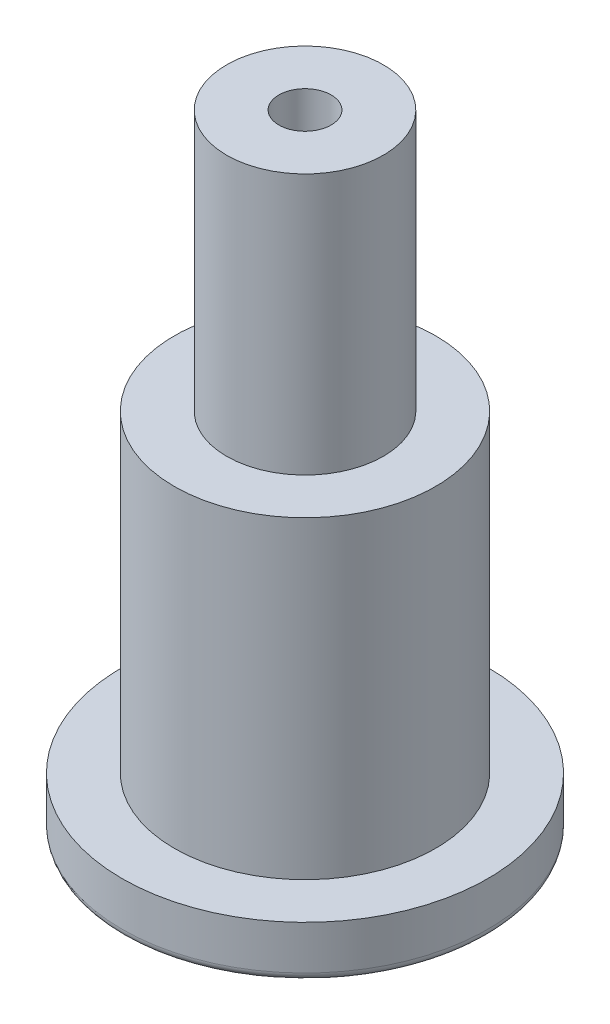
ISO-10303-21;
HEADER;
FILE_DESCRIPTION(('STEP AP214'),'2;1');
FILE_NAME('part.step','',(''),(''),'','','');
FILE_SCHEMA(('AUTOMOTIVE_DESIGN { 1 0 10303 214 1 1 1 1 }'));
ENDSEC;
DATA;
#1=APPLICATION_CONTEXT('core data for automotive mechanical design processes');
#2=APPLICATION_PROTOCOL_DEFINITION('international standard','automotive_design',2000,#1);
#3=PRODUCT_CONTEXT('',#1,'mechanical');
#4=PRODUCT('Part','Part','',(#3));
#5=PRODUCT_RELATED_PRODUCT_CATEGORY('part','',(#4));
#6=PRODUCT_DEFINITION_FORMATION('','',#4);
#7=PRODUCT_DEFINITION_CONTEXT('part definition',#1,'design');
#8=PRODUCT_DEFINITION('design','',#6,#7);
#9=PRODUCT_DEFINITION_SHAPE('','',#8);
#10=(LENGTH_UNIT() NAMED_UNIT(*) SI_UNIT(.MILLI.,.METRE.));
#11=(NAMED_UNIT(*) PLANE_ANGLE_UNIT() SI_UNIT($,.RADIAN.));
#12=(NAMED_UNIT(*) SI_UNIT($,.STERADIAN.) SOLID_ANGLE_UNIT());
#13=UNCERTAINTY_MEASURE_WITH_UNIT(LENGTH_MEASURE(1.E-05),#10,'distance_accuracy_value','');
#14=(GEOMETRIC_REPRESENTATION_CONTEXT(3) GLOBAL_UNCERTAINTY_ASSIGNED_CONTEXT((#13)) GLOBAL_UNIT_ASSIGNED_CONTEXT((#10,
#11,#12)) REPRESENTATION_CONTEXT('',''));
#15=CARTESIAN_POINT('',(0.,0.,0.));
#16=DIRECTION('',(0.,0.,1.));
#17=DIRECTION('',(1.,0.,0.));
#18=AXIS2_PLACEMENT_3D('',#15,#16,#17);
#19=CARTESIAN_POINT('',(0.,1.5875,0.));
#20=DIRECTION('',(0.,-1.,0.));
#21=DIRECTION('',(0.,0.,-1.));
#22=AXIS2_PLACEMENT_3D('',#19,#20,#21);
#23=CYLINDRICAL_SURFACE('',#22,5.55625);
#24=CARTESIAN_POINT('',(0.,0.254,0.));
#25=DIRECTION('',(0.,1.,0.));
#26=DIRECTION('',(0.,0.,1.));
#27=AXIS2_PLACEMENT_3D('',#24,#25,#26);
#28=CIRCLE('',#27,5.55625);
#29=CARTESIAN_POINT('',(0.,0.254,5.55625));
#30=VERTEX_POINT('',#29);
#31=EDGE_CURVE('E52',#30,#30,#28,.T.);
#32=ORIENTED_EDGE('',*,*,#31,.T.);
#33=EDGE_LOOP('',(#32));
#34=FACE_BOUND('',#33,.T.);
#35=CARTESIAN_POINT('',(0.,1.5875,0.));
#36=DIRECTION('',(0.,1.,0.));
#37=DIRECTION('',(0.,0.,1.));
#38=AXIS2_PLACEMENT_3D('',#35,#36,#37);
#39=CIRCLE('',#38,5.55625);
#40=CARTESIAN_POINT('',(0.,1.5875,5.55625));
#41=VERTEX_POINT('',#40);
#42=EDGE_CURVE('E65',#41,#41,#39,.T.);
#43=ORIENTED_EDGE('',*,*,#42,.F.);
#44=EDGE_LOOP('',(#43));
#45=FACE_BOUND('',#44,.T.);
#46=ADVANCED_FACE('F44',(#34,#45),#23,.T.);
#47=CARTESIAN_POINT('',(0.,1.5875,0.));
#48=DIRECTION('',(0.,1.,0.));
#49=DIRECTION('',(0.,0.,1.));
#50=AXIS2_PLACEMENT_3D('',#47,#48,#49);
#51=PLANE('',#50);
#52=CARTESIAN_POINT('',(0.,1.5875,0.));
#53=DIRECTION('',(0.,1.,0.));
#54=DIRECTION('',(0.,0.,1.));
#55=AXIS2_PLACEMENT_3D('',#52,#53,#54);
#56=CIRCLE('',#55,3.96875);
#57=CARTESIAN_POINT('',(0.,1.5875,-3.96875));
#58=VERTEX_POINT('',#57);
#59=EDGE_CURVE('E62',#58,#58,#56,.T.);
#60=ORIENTED_EDGE('',*,*,#59,.F.);
#61=EDGE_LOOP('',(#60));
#62=FACE_BOUND('',#61,.T.);
#63=ORIENTED_EDGE('',*,*,#42,.T.);
#64=EDGE_LOOP('',(#63));
#65=FACE_BOUND('',#64,.T.);
#66=ADVANCED_FACE('F110',(#62,#65),#51,.T.);
#67=CARTESIAN_POINT('',(0.,0.,0.));
#68=DIRECTION('',(0.,1.,0.));
#69=DIRECTION('',(0.,0.,1.));
#70=AXIS2_PLACEMENT_3D('',#67,#68,#69);
#71=PLANE('',#70);
#72=CARTESIAN_POINT('',(0.,0.,0.));
#73=DIRECTION('',(0.,1.,0.));
#74=DIRECTION('',(0.,0.,1.));
#75=AXIS2_PLACEMENT_3D('',#72,#73,#74);
#76=CIRCLE('',#75,5.30225);
#77=CARTESIAN_POINT('',(0.,0.,5.30225));
#78=VERTEX_POINT('',#77);
#79=EDGE_CURVE('E11',#78,#78,#76,.F.);
#80=ORIENTED_EDGE('',*,*,#79,.T.);
#81=EDGE_LOOP('',(#80));
#82=FACE_BOUND('',#81,.T.);
#83=ADVANCED_FACE('F114',(#82),#71,.F.);
#84=CARTESIAN_POINT('',(0.,11.1125,0.));
#85=DIRECTION('',(0.,-1.,0.));
#86=DIRECTION('',(0.,0.,-1.));
#87=AXIS2_PLACEMENT_3D('',#84,#85,#86);
#88=CYLINDRICAL_SURFACE('',#87,3.96875);
#89=CARTESIAN_POINT('',(0.,11.1125,0.));
#90=DIRECTION('',(0.,1.,0.));
#91=DIRECTION('',(0.,0.,1.));
#92=AXIS2_PLACEMENT_3D('',#89,#90,#91);
#93=CIRCLE('',#92,3.96875);
#94=CARTESIAN_POINT('',(0.,11.1125,-3.96875));
#95=VERTEX_POINT('',#94);
#96=EDGE_CURVE('E69',#95,#95,#93,.T.);
#97=CARTESIAN_POINT('',(0.,11.1125,-3.96875));
#98=CARTESIAN_POINT('',(0.,11.01328125,-3.96875));
#99=CARTESIAN_POINT('',(0.,10.9140625,-3.96875));
#100=CARTESIAN_POINT('',(0.,10.715625,-3.96875));
#101=CARTESIAN_POINT('',(0.,10.61640625,-3.96875));
#102=CARTESIAN_POINT('',(0.,10.41796875,-3.96875));
#103=CARTESIAN_POINT('',(0.,10.31875,-3.96875));
#104=CARTESIAN_POINT('',(0.,10.1203125,-3.96875));
#105=CARTESIAN_POINT('',(0.,10.02109375,-3.96875));
#106=CARTESIAN_POINT('',(0.,9.82265625,-3.96875));
#107=CARTESIAN_POINT('',(0.,9.7234375,-3.96875));
#108=CARTESIAN_POINT('',(0.,9.525,-3.96875));
#109=CARTESIAN_POINT('',(0.,9.42578125,-3.96875));
#110=CARTESIAN_POINT('',(0.,9.22734375,-3.96875));
#111=CARTESIAN_POINT('',(0.,9.128125,-3.96875));
#112=CARTESIAN_POINT('',(0.,8.9296875,-3.96875));
#113=CARTESIAN_POINT('',(0.,8.83046875,-3.96875));
#114=CARTESIAN_POINT('',(0.,8.63203125,-3.96875));
#115=CARTESIAN_POINT('',(0.,8.5328125,-3.96875));
#116=CARTESIAN_POINT('',(0.,8.334375,-3.96875));
#117=CARTESIAN_POINT('',(0.,8.23515625,-3.96875));
#118=CARTESIAN_POINT('',(0.,8.03671875,-3.96875));
#119=CARTESIAN_POINT('',(0.,7.9375,-3.96875));
#120=CARTESIAN_POINT('',(0.,7.7390625,-3.96875));
#121=CARTESIAN_POINT('',(0.,7.63984375,-3.96875));
#122=CARTESIAN_POINT('',(0.,7.44140625,-3.96875));
#123=CARTESIAN_POINT('',(0.,7.3421875,-3.96875));
#124=CARTESIAN_POINT('',(0.,7.14375,-3.96875));
#125=CARTESIAN_POINT('',(0.,7.04453125,-3.96875));
#126=CARTESIAN_POINT('',(0.,6.84609375,-3.96875));
#127=CARTESIAN_POINT('',(0.,6.746875,-3.96875));
#128=CARTESIAN_POINT('',(0.,6.5484375,-3.96875));
#129=CARTESIAN_POINT('',(0.,6.44921875,-3.96875));
#130=CARTESIAN_POINT('',(0.,6.25078125,-3.96875));
#131=CARTESIAN_POINT('',(0.,6.1515625,-3.96875));
#132=CARTESIAN_POINT('',(0.,5.953125,-3.96875));
#133=CARTESIAN_POINT('',(0.,5.85390625,-3.96875));
#134=CARTESIAN_POINT('',(0.,5.65546875,-3.96875));
#135=CARTESIAN_POINT('',(0.,5.55625,-3.96875));
#136=CARTESIAN_POINT('',(0.,5.3578125,-3.96875));
#137=CARTESIAN_POINT('',(0.,5.25859375,-3.96875));
#138=CARTESIAN_POINT('',(0.,5.06015625,-3.96875));
#139=CARTESIAN_POINT('',(0.,4.9609375,-3.96875));
#140=CARTESIAN_POINT('',(0.,4.7625,-3.96875));
#141=CARTESIAN_POINT('',(0.,4.66328125,-3.96875));
#142=CARTESIAN_POINT('',(0.,4.46484375,-3.96875));
#143=CARTESIAN_POINT('',(0.,4.365625,-3.96875));
#144=CARTESIAN_POINT('',(0.,4.1671875,-3.96875));
#145=CARTESIAN_POINT('',(0.,4.06796875,-3.96875));
#146=CARTESIAN_POINT('',(0.,3.86953125,-3.96875));
#147=CARTESIAN_POINT('',(0.,3.7703125,-3.96875));
#148=CARTESIAN_POINT('',(0.,3.571875,-3.96875));
#149=CARTESIAN_POINT('',(0.,3.47265625,-3.96875));
#150=CARTESIAN_POINT('',(0.,3.27421875,-3.96875));
#151=CARTESIAN_POINT('',(0.,3.175,-3.96875));
#152=CARTESIAN_POINT('',(0.,2.9765625,-3.96875));
#153=CARTESIAN_POINT('',(0.,2.87734375,-3.96875));
#154=CARTESIAN_POINT('',(0.,2.67890625,-3.96875));
#155=CARTESIAN_POINT('',(0.,2.5796875,-3.96875));
#156=CARTESIAN_POINT('',(0.,2.38125,-3.96875));
#157=CARTESIAN_POINT('',(0.,2.28203125,-3.96875));
#158=CARTESIAN_POINT('',(0.,2.08359375,-3.96875));
#159=CARTESIAN_POINT('',(0.,1.984375,-3.96875));
#160=CARTESIAN_POINT('',(0.,1.7859375,-3.96875));
#161=CARTESIAN_POINT('',(0.,1.68671875,-3.96875));
#162=CARTESIAN_POINT('',(0.,1.5875,-3.96875));
#163=B_SPLINE_CURVE_WITH_KNOTS('',3,(#97,#98,#99,#100,#101,#102,#103,#104,#105,#106,#107,#108,
#109,#110,#111,#112,#113,#114,#115,#116,#117,#118,#119,#120,#121,#122,#123,#124,#125,#126,#127,
#128,#129,#130,#131,#132,#133,#134,#135,#136,#137,#138,#139,#140,#141,#142,#143,#144,#145,#146,
#147,#148,#149,#150,#151,#152,#153,#154,#155,#156,#157,#158,#159,#160,#161,#162),.UNSPECIFIED.,
.F.,.F.,(4,2,2,2,2,2,2,2,2,2,2,2,2,2,2,2,2,2,2,2,2,2,2,2,2,2,2,2,2,2,2,2,4),(0.,
0.297656249999998,0.595312499999999,0.892968749999999,1.190625,1.48828125,1.7859375,2.08359375,
2.38125,2.67890625,2.9765625,3.27421875,3.571875,3.86953125,4.1671875,4.46484375,4.7625,
5.06015625,5.3578125,5.65546875,5.953125,6.25078125,6.5484375,6.84609375,7.14375,7.44140625,
7.7390625,8.03671875,8.334375,8.63203125,8.9296875,9.22734375,9.525),.UNSPECIFIED.);
#164=EDGE_CURVE('BSEAM104',#95,#58,#163,.T.);
#165=ORIENTED_EDGE('',*,*,#96,.F.);
#166=ORIENTED_EDGE('',*,*,#59,.T.);
#167=ORIENTED_EDGE('',*,*,#164,.T.);
#168=ORIENTED_EDGE('',*,*,#164,.F.);
#169=EDGE_LOOP('',(#165,#167,#166,#168));
#170=FACE_BOUND('',#169,.T.);
#171=ADVANCED_FACE('F104',(#170),#88,.T.);
#172=CARTESIAN_POINT('',(0.,11.1125,0.));
#173=DIRECTION('',(0.,1.,0.));
#174=DIRECTION('',(0.,0.,1.));
#175=AXIS2_PLACEMENT_3D('',#172,#173,#174);
#176=PLANE('',#175);
#177=CARTESIAN_POINT('',(0.,11.1125,0.));
#178=DIRECTION('',(0.,1.,0.));
#179=DIRECTION('',(0.,0.,1.));
#180=AXIS2_PLACEMENT_3D('',#177,#178,#179);
#181=CIRCLE('',#180,2.38125);
#182=CARTESIAN_POINT('',(0.,11.1125,2.38125));
#183=VERTEX_POINT('',#182);
#184=EDGE_CURVE('E77',#183,#183,#181,.T.);
#185=ORIENTED_EDGE('',*,*,#184,.F.);
#186=EDGE_LOOP('',(#185));
#187=FACE_BOUND('',#186,.T.);
#188=ORIENTED_EDGE('',*,*,#96,.T.);
#189=EDGE_LOOP('',(#188));
#190=FACE_BOUND('',#189,.T.);
#191=ADVANCED_FACE('F95',(#187,#190),#176,.T.);
#192=CARTESIAN_POINT('',(0.,19.0373,0.));
#193=DIRECTION('',(0.,1.,0.));
#194=DIRECTION('',(0.,0.,1.));
#195=AXIS2_PLACEMENT_3D('',#192,#193,#194);
#196=PLANE('',#195);
#197=CARTESIAN_POINT('',(0.,19.0373,0.));
#198=DIRECTION('',(0.,1.,0.));
#199=DIRECTION('',(0.,0.,1.));
#200=AXIS2_PLACEMENT_3D('',#197,#198,#199);
#201=CIRCLE('',#200,2.38125);
#202=CARTESIAN_POINT('',(0.,19.0373,2.38125));
#203=VERTEX_POINT('',#202);
#204=EDGE_CURVE('E76',#203,#203,#201,.T.);
#205=ORIENTED_EDGE('',*,*,#204,.T.);
#206=EDGE_LOOP('',(#205));
#207=FACE_BOUND('',#206,.T.);
#208=CARTESIAN_POINT('',(0.,19.0373,0.));
#209=DIRECTION('',(0.,1.,0.));
#210=DIRECTION('',(1.,0.,0.));
#211=AXIS2_PLACEMENT_3D('',#208,#209,#210);
#212=CIRCLE('',#211,0.79375);
#213=CARTESIAN_POINT('',(0.79375,19.0373,0.));
#214=VERTEX_POINT('',#213);
#215=EDGE_CURVE('E81',#214,#214,#212,.T.);
#216=ORIENTED_EDGE('',*,*,#215,.F.);
#217=EDGE_LOOP('',(#216));
#218=FACE_BOUND('',#217,.T.);
#219=ADVANCED_FACE('F92',(#207,#218),#196,.T.);
#220=CARTESIAN_POINT('',(0.,19.0373,0.));
#221=DIRECTION('',(0.,-1.,0.));
#222=DIRECTION('',(0.,0.,-1.));
#223=AXIS2_PLACEMENT_3D('',#220,#221,#222);
#224=CYLINDRICAL_SURFACE('',#223,2.38125);
#225=ORIENTED_EDGE('',*,*,#204,.F.);
#226=EDGE_LOOP('',(#225));
#227=FACE_BOUND('',#226,.T.);
#228=ORIENTED_EDGE('',*,*,#184,.T.);
#229=EDGE_LOOP('',(#228));
#230=FACE_BOUND('',#229,.T.);
#231=ADVANCED_FACE('F94',(#227,#230),#224,.T.);
#232=CARTESIAN_POINT('',(0.,19.0373,0.));
#233=DIRECTION('',(0.,-1.,0.));
#234=DIRECTION('',(0.,0.,-1.));
#235=AXIS2_PLACEMENT_3D('',#232,#233,#234);
#236=CYLINDRICAL_SURFACE('',#235,0.79375);
#237=ORIENTED_EDGE('',*,*,#215,.T.);
#238=EDGE_LOOP('',(#237));
#239=FACE_BOUND('',#238,.T.);
#240=CARTESIAN_POINT('',(0.,11.1125,0.));
#241=DIRECTION('',(0.,1.,0.));
#242=DIRECTION('',(0.,0.,1.));
#243=AXIS2_PLACEMENT_3D('',#240,#241,#242);
#244=CIRCLE('',#243,0.79375);
#245=CARTESIAN_POINT('',(0.,11.1125,0.79375));
#246=VERTEX_POINT('',#245);
#247=EDGE_CURVE('E57',#246,#246,#244,.F.);
#248=ORIENTED_EDGE('',*,*,#247,.T.);
#249=EDGE_LOOP('',(#248));
#250=FACE_BOUND('',#249,.T.);
#251=ADVANCED_FACE('F89',(#239,#250),#236,.F.);
#252=ORIENTED_EDGE('',*,*,#247,.F.);
#253=EDGE_LOOP('',(#252));
#254=FACE_BOUND('',#253,.T.);
#255=ADVANCED_FACE('F107',(#254),#176,.T.);
#256=CARTESIAN_POINT('',(0.,0.254,0.));
#257=DIRECTION('',(0.,1.,0.));
#258=DIRECTION('',(0.,0.,1.));
#259=AXIS2_PLACEMENT_3D('',#256,#257,#258);
#260=TOROIDAL_SURFACE('',#259,5.30225,0.254);
#261=ORIENTED_EDGE('',*,*,#79,.F.);
#262=EDGE_LOOP('',(#261));
#263=FACE_BOUND('',#262,.T.);
#264=ORIENTED_EDGE('',*,*,#31,.F.);
#265=EDGE_LOOP('',(#264));
#266=FACE_BOUND('',#265,.T.);
#267=ADVANCED_FACE('F46',(#263,#266),#260,.T.);
#268=CLOSED_SHELL('',(#46,#66,#83,#171,#191,#219,#231,#251,#255,#267));
#269=MANIFOLD_SOLID_BREP('B2',#268);
#270=ADVANCED_BREP_SHAPE_REPRESENTATION('',(#18,#269),#14);
#271=SHAPE_DEFINITION_REPRESENTATION(#9,#270);
ENDSEC;
END-ISO-10303-21;
